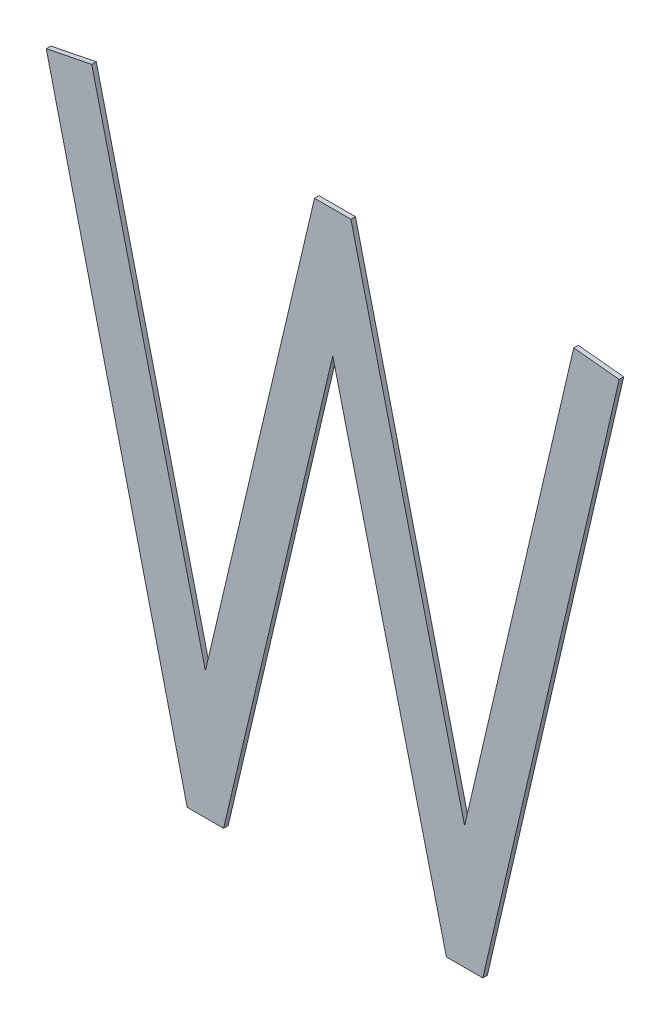
ISO-10303-21;
HEADER;
FILE_DESCRIPTION(('STEP AP214'),'2;1');
FILE_NAME('part.step','',(''),(''),'','','');
FILE_SCHEMA(('AUTOMOTIVE_DESIGN { 1 0 10303 214 1 1 1 1 }'));
ENDSEC;
DATA;
#1=APPLICATION_CONTEXT('core data for automotive mechanical design processes');
#2=APPLICATION_PROTOCOL_DEFINITION('international standard','automotive_design',2000,#1);
#3=PRODUCT_CONTEXT('',#1,'mechanical');
#4=PRODUCT('Part','Part','',(#3));
#5=PRODUCT_RELATED_PRODUCT_CATEGORY('part','',(#4));
#6=PRODUCT_DEFINITION_FORMATION('','',#4);
#7=PRODUCT_DEFINITION_CONTEXT('part definition',#1,'design');
#8=PRODUCT_DEFINITION('design','',#6,#7);
#9=PRODUCT_DEFINITION_SHAPE('','',#8);
#10=(LENGTH_UNIT() NAMED_UNIT(*) SI_UNIT(.MILLI.,.METRE.));
#11=(NAMED_UNIT(*) PLANE_ANGLE_UNIT() SI_UNIT($,.RADIAN.));
#12=(NAMED_UNIT(*) SI_UNIT($,.STERADIAN.) SOLID_ANGLE_UNIT());
#13=UNCERTAINTY_MEASURE_WITH_UNIT(LENGTH_MEASURE(1.E-05),#10,'distance_accuracy_value','');
#14=(GEOMETRIC_REPRESENTATION_CONTEXT(3) GLOBAL_UNCERTAINTY_ASSIGNED_CONTEXT((#13)) GLOBAL_UNIT_ASSIGNED_CONTEXT((#10,
#11,#12)) REPRESENTATION_CONTEXT('',''));
#15=CARTESIAN_POINT('',(0.,0.,0.));
#16=DIRECTION('',(0.,0.,1.));
#17=DIRECTION('',(1.,0.,0.));
#18=AXIS2_PLACEMENT_3D('',#15,#16,#17);
#19=CARTESIAN_POINT('',(-0.62999874,0.635,0.01));
#20=DIRECTION('',(0.,0.,-1.));
#21=DIRECTION('',(-1.,0.,0.));
#22=AXIS2_PLACEMENT_3D('',#19,#20,#21);
#23=PLANE('',#22);
#24=DIRECTION('',(1.,0.,0.));
#25=VECTOR('',#24,1.);
#26=CARTESIAN_POINT('',(-0.31999682,-0.65499996,0.01));
#27=LINE('',#26,#25);
#28=CARTESIAN_POINT('',(-0.319996819999876,-0.65499995999997,0.01));
#29=VERTEX_POINT('',#28);
#30=CARTESIAN_POINT('',(-0.23999698,-0.65499996,0.01));
#31=VERTEX_POINT('',#30);
#32=EDGE_CURVE('E166',#29,#31,#27,.T.);
#33=ORIENTED_EDGE('',*,*,#32,.T.);
#34=DIRECTION('',(-0.229038793293004,-0.973417295494016,0.));
#35=VECTOR('',#34,1.);
#36=CARTESIAN_POINT('',(-0.23999698,-0.65499996,0.01));
#37=LINE('',#36,#35);
#38=CARTESIAN_POINT('',(2.53999999732642E-06,0.36500054,0.01));
#39=VERTEX_POINT('',#38);
#40=EDGE_CURVE('E162',#31,#39,#37,.F.);
#41=ORIENTED_EDGE('',*,*,#40,.T.);
#42=DIRECTION('',(-0.238051498762019,0.971252533555077,0.));
#43=VECTOR('',#42,1.);
#44=CARTESIAN_POINT('',(2.539999996998E-06,0.36500054,0.01));
#45=LINE('',#44,#43);
#46=CARTESIAN_POINT('',(0.250002040000122,-0.65499995999997,0.01));
#47=VERTEX_POINT('',#46);
#48=EDGE_CURVE('E158',#39,#47,#45,.F.);
#49=ORIENTED_EDGE('',*,*,#48,.T.);
#50=DIRECTION('',(1.,0.,0.));
#51=VECTOR('',#50,1.);
#52=CARTESIAN_POINT('',(0.25000204,-0.65499996,0.01));
#53=LINE('',#52,#51);
#54=CARTESIAN_POINT('',(0.33000188,-0.65499996,0.01));
#55=VERTEX_POINT('',#54);
#56=EDGE_CURVE('E154',#47,#55,#53,.T.);
#57=ORIENTED_EDGE('',*,*,#56,.T.);
#58=DIRECTION('',(-0.226513071540985,-0.974008125438935,0.));
#59=VECTOR('',#58,1.);
#60=CARTESIAN_POINT('',(0.33000188,-0.65499996,0.01));
#61=LINE('',#60,#59);
#62=CARTESIAN_POINT('',(0.630001280000132,0.634999999999969,0.01));
#63=VERTEX_POINT('',#62);
#64=EDGE_CURVE('E150',#55,#63,#61,.F.);
#65=ORIENTED_EDGE('',*,*,#64,.T.);
#66=DIRECTION('',(0.995037190210014,-0.0995037190207514,0.));
#67=VECTOR('',#66,1.);
#68=CARTESIAN_POINT('',(0.63000128,0.635,0.01));
#69=LINE('',#68,#67);
#70=CARTESIAN_POINT('',(0.530001479999999,0.644999979999994,0.01));
#71=VERTEX_POINT('',#70);
#72=EDGE_CURVE('E146',#63,#71,#69,.F.);
#73=ORIENTED_EDGE('',*,*,#72,.T.);
#74=DIRECTION('',(0.22693069724005,0.973910908990214,0.));
#75=VECTOR('',#74,1.);
#76=CARTESIAN_POINT('',(0.53000148,0.64499998,0.01));
#77=LINE('',#76,#75);
#78=CARTESIAN_POINT('',(0.290001960000097,-0.384997960000023,0.01));
#79=VERTEX_POINT('',#78);
#80=EDGE_CURVE('E142',#71,#79,#77,.F.);
#81=ORIENTED_EDGE('',*,*,#80,.T.);
#82=DIRECTION('',(0.235870049887924,-0.971784605540687,0.));
#83=VECTOR('',#82,1.);
#84=CARTESIAN_POINT('',(0.29000196,-0.38499796,0.01));
#85=LINE('',#84,#83);
#86=CARTESIAN_POINT('',(0.0400024600001329,0.644999980000037,0.01));
#87=VERTEX_POINT('',#86);
#88=EDGE_CURVE('E138',#79,#87,#85,.F.);
#89=ORIENTED_EDGE('',*,*,#88,.T.);
#90=DIRECTION('',(1.,0.,0.));
#91=VECTOR('',#90,1.);
#92=CARTESIAN_POINT('',(0.04000245999998,0.64499998,0.01));
#93=LINE('',#92,#91);
#94=CARTESIAN_POINT('',(-0.03999738000002,0.64499998,0.01));
#95=VERTEX_POINT('',#94);
#96=EDGE_CURVE('E134',#87,#95,#93,.F.);
#97=ORIENTED_EDGE('',*,*,#96,.T.);
#98=DIRECTION('',(0.229039333726105,0.973417168333445,0.));
#99=VECTOR('',#98,1.);
#100=CARTESIAN_POINT('',(-0.03999738000002,0.64499998,0.01));
#101=LINE('',#100,#99);
#102=CARTESIAN_POINT('',(-0.279996900000151,-0.374997979999965,0.01));
#103=VERTEX_POINT('',#102);
#104=EDGE_CURVE('E110',#95,#103,#101,.F.);
#105=ORIENTED_EDGE('',*,*,#104,.T.);
#106=DIRECTION('',(0.23587231300609,-0.971784056237371,0.));
#107=VECTOR('',#106,1.);
#108=CARTESIAN_POINT('',(-0.2799969,-0.37499798,0.01));
#109=LINE('',#108,#107);
#110=CARTESIAN_POINT('',(-0.529998940000119,0.654999959999971,0.01));
#111=VERTEX_POINT('',#110);
#112=EDGE_CURVE('E112',#103,#111,#109,.F.);
#113=ORIENTED_EDGE('',*,*,#112,.T.);
#114=DIRECTION('',(0.980580675690959,0.196116135137992,0.));
#115=VECTOR('',#114,1.);
#116=CARTESIAN_POINT('',(-0.52999894,0.65499996,0.01));
#117=LINE('',#116,#115);
#118=CARTESIAN_POINT('',(-0.629998740000002,0.63500000000001,0.01));
#119=VERTEX_POINT('',#118);
#120=EDGE_CURVE('E20',#111,#119,#117,.F.);
#121=ORIENTED_EDGE('',*,*,#120,.T.);
#122=DIRECTION('',(-0.233659391412928,0.972318512013702,0.));
#123=VECTOR('',#122,1.);
#124=CARTESIAN_POINT('',(-0.62999874,0.635,0.01));
#125=LINE('',#124,#123);
#126=EDGE_CURVE('E171',#119,#29,#125,.F.);
#127=ORIENTED_EDGE('',*,*,#126,.T.);
#128=EDGE_LOOP('',(#33,#41,#49,#57,#65,#73,#81,#89,#97,#105,#113,#121,#127));
#129=FACE_BOUND('',#128,.T.);
#130=ADVANCED_FACE('F17',(#129),#23,.F.);
#131=CARTESIAN_POINT('',(-0.52999894,0.65499996,0.));
#132=DIRECTION('',(0.196116135137992,-0.980580675690959,0.));
#133=DIRECTION('',(0.980580675690959,0.196116135137992,0.));
#134=AXIS2_PLACEMENT_3D('',#131,#132,#133);
#135=PLANE('',#134);
#136=DIRECTION('',(0.,0.,1.));
#137=VECTOR('',#136,1.);
#138=CARTESIAN_POINT('',(-0.62999874,0.635,0.));
#139=LINE('',#138,#137);
#140=CARTESIAN_POINT('',(-0.629998740000002,0.63500000000001,0.));
#141=VERTEX_POINT('',#140);
#142=EDGE_CURVE('E123',#141,#119,#139,.T.);
#143=ORIENTED_EDGE('',*,*,#142,.T.);
#144=ORIENTED_EDGE('',*,*,#120,.F.);
#145=DIRECTION('',(0.,0.,1.));
#146=VECTOR('',#145,1.);
#147=CARTESIAN_POINT('',(-0.529998940000477,0.654999959999884,0.));
#148=LINE('',#147,#146);
#149=CARTESIAN_POINT('',(-0.529998940000119,0.654999959999971,0.));
#150=VERTEX_POINT('',#149);
#151=EDGE_CURVE('E118',#111,#150,#148,.F.);
#152=ORIENTED_EDGE('',*,*,#151,.T.);
#153=DIRECTION('',(0.98058067569092,0.196116135138184,0.));
#154=VECTOR('',#153,1.);
#155=CARTESIAN_POINT('',(-0.62999874,0.635,0.));
#156=LINE('',#155,#154);
#157=EDGE_CURVE('E174',#141,#150,#156,.T.);
#158=ORIENTED_EDGE('',*,*,#157,.F.);
#159=EDGE_LOOP('',(#143,#144,#152,#158));
#160=FACE_BOUND('',#159,.T.);
#161=ADVANCED_FACE('F120',(#160),#135,.F.);
#162=CARTESIAN_POINT('',(-0.2799969,-0.37499798,0.));
#163=DIRECTION('',(-0.971784056237371,-0.23587231300609,0.));
#164=DIRECTION('',(0.23587231300609,-0.971784056237371,0.));
#165=AXIS2_PLACEMENT_3D('',#162,#163,#164);
#166=PLANE('',#165);
#167=ORIENTED_EDGE('',*,*,#151,.F.);
#168=ORIENTED_EDGE('',*,*,#112,.F.);
#169=DIRECTION('',(0.,0.,1.));
#170=VECTOR('',#169,1.);
#171=CARTESIAN_POINT('',(-0.279996900000603,-0.374997979999858,0.));
#172=LINE('',#171,#170);
#173=CARTESIAN_POINT('',(-0.279996900000151,-0.374997979999965,0.));
#174=VERTEX_POINT('',#173);
#175=EDGE_CURVE('E130',#103,#174,#172,.F.);
#176=ORIENTED_EDGE('',*,*,#175,.T.);
#177=DIRECTION('',(0.23587231300564,-0.97178405623748,0.));
#178=VECTOR('',#177,1.);
#179=CARTESIAN_POINT('',(-0.52999894,0.65499996,0.));
#180=LINE('',#179,#178);
#181=EDGE_CURVE('E127',#150,#174,#180,.T.);
#182=ORIENTED_EDGE('',*,*,#181,.F.);
#183=EDGE_LOOP('',(#167,#168,#176,#182));
#184=FACE_BOUND('',#183,.T.);
#185=ADVANCED_FACE('F125',(#184),#166,.F.);
#186=CARTESIAN_POINT('',(-0.03999738000002,0.64499998,0.));
#187=DIRECTION('',(0.973417168333445,-0.229039333726105,0.));
#188=DIRECTION('',(0.229039333726105,0.973417168333445,0.));
#189=AXIS2_PLACEMENT_3D('',#186,#187,#188);
#190=PLANE('',#189);
#191=ORIENTED_EDGE('',*,*,#175,.F.);
#192=ORIENTED_EDGE('',*,*,#104,.F.);
#193=DIRECTION('',(0.,0.,-1.));
#194=VECTOR('',#193,1.);
#195=CARTESIAN_POINT('',(-0.03999738000002,0.64499998,0.));
#196=LINE('',#195,#194);
#197=CARTESIAN_POINT('',(-0.03999738000002,0.64499998,0.));
#198=VERTEX_POINT('',#197);
#199=EDGE_CURVE('E136',#95,#198,#196,.T.);
#200=ORIENTED_EDGE('',*,*,#199,.T.);
#201=DIRECTION('',(0.229039333725529,0.97341716833358,0.));
#202=VECTOR('',#201,1.);
#203=CARTESIAN_POINT('',(-0.2799969,-0.37499798,0.));
#204=LINE('',#203,#202);
#205=EDGE_CURVE('E177',#174,#198,#204,.T.);
#206=ORIENTED_EDGE('',*,*,#205,.F.);
#207=EDGE_LOOP('',(#191,#192,#200,#206));
#208=FACE_BOUND('',#207,.T.);
#209=ADVANCED_FACE('F251',(#208),#190,.F.);
#210=CARTESIAN_POINT('',(0.04000245999998,0.64499998,0.));
#211=DIRECTION('',(0.,-1.,0.));
#212=DIRECTION('',(0.,0.,-1.));
#213=AXIS2_PLACEMENT_3D('',#210,#211,#212);
#214=PLANE('',#213);
#215=ORIENTED_EDGE('',*,*,#199,.F.);
#216=ORIENTED_EDGE('',*,*,#96,.F.);
#217=DIRECTION('',(0.,0.,1.));
#218=VECTOR('',#217,1.);
#219=CARTESIAN_POINT('',(0.0400024600005917,0.644999980000149,0.));
#220=LINE('',#219,#218);
#221=CARTESIAN_POINT('',(0.0400024600001329,0.644999980000037,0.));
#222=VERTEX_POINT('',#221);
#223=EDGE_CURVE('E140',#87,#222,#220,.F.);
#224=ORIENTED_EDGE('',*,*,#223,.T.);
#225=DIRECTION('',(-1.,0.,0.));
#226=VECTOR('',#225,1.);
#227=CARTESIAN_POINT('',(-0.62999874,0.64499998,0.));
#228=LINE('',#227,#226);
#229=EDGE_CURVE('E180',#198,#222,#228,.F.);
#230=ORIENTED_EDGE('',*,*,#229,.F.);
#231=EDGE_LOOP('',(#215,#216,#224,#230));
#232=FACE_BOUND('',#231,.T.);
#233=ADVANCED_FACE('F247',(#232),#214,.F.);
#234=CARTESIAN_POINT('',(0.29000196,-0.38499796,0.));
#235=DIRECTION('',(-0.971784605540687,-0.235870049887924,0.));
#236=DIRECTION('',(0.235870049887924,-0.971784605540687,0.));
#237=AXIS2_PLACEMENT_3D('',#234,#235,#236);
#238=PLANE('',#237);
#239=ORIENTED_EDGE('',*,*,#223,.F.);
#240=ORIENTED_EDGE('',*,*,#88,.F.);
#241=DIRECTION('',(0.,0.,1.));
#242=VECTOR('',#241,1.);
#243=CARTESIAN_POINT('',(0.29000196000039,-0.384997960000091,0.));
#244=LINE('',#243,#242);
#245=CARTESIAN_POINT('',(0.290001960000097,-0.384997960000023,0.));
#246=VERTEX_POINT('',#245);
#247=EDGE_CURVE('E144',#79,#246,#244,.F.);
#248=ORIENTED_EDGE('',*,*,#247,.T.);
#249=DIRECTION('',(0.235870049888501,-0.971784605540547,0.));
#250=VECTOR('',#249,1.);
#251=CARTESIAN_POINT('',(0.04000245999998,0.64499998,0.));
#252=LINE('',#251,#250);
#253=EDGE_CURVE('E183',#222,#246,#252,.T.);
#254=ORIENTED_EDGE('',*,*,#253,.F.);
#255=EDGE_LOOP('',(#239,#240,#248,#254));
#256=FACE_BOUND('',#255,.T.);
#257=ADVANCED_FACE('F243',(#256),#238,.F.);
#258=CARTESIAN_POINT('',(0.53000148,0.64499998,0.));
#259=DIRECTION('',(0.973910908990214,-0.22693069724005,0.));
#260=DIRECTION('',(0.22693069724005,0.973910908990214,0.));
#261=AXIS2_PLACEMENT_3D('',#258,#259,#260);
#262=PLANE('',#261);
#263=ORIENTED_EDGE('',*,*,#247,.F.);
#264=ORIENTED_EDGE('',*,*,#80,.F.);
#265=DIRECTION('',(0.,0.,1.));
#266=VECTOR('',#265,1.);
#267=CARTESIAN_POINT('',(0.530001479999998,0.644999979999975,0.));
#268=LINE('',#267,#266);
#269=CARTESIAN_POINT('',(0.530001479999999,0.644999979999994,0.));
#270=VERTEX_POINT('',#269);
#271=EDGE_CURVE('E148',#71,#270,#268,.F.);
#272=ORIENTED_EDGE('',*,*,#271,.T.);
#273=DIRECTION('',(0.226930697240418,0.973910908990128,0.));
#274=VECTOR('',#273,1.);
#275=CARTESIAN_POINT('',(0.29000196,-0.38499796,0.));
#276=LINE('',#275,#274);
#277=EDGE_CURVE('E186',#246,#270,#276,.T.);
#278=ORIENTED_EDGE('',*,*,#277,.F.);
#279=EDGE_LOOP('',(#263,#264,#272,#278));
#280=FACE_BOUND('',#279,.T.);
#281=ADVANCED_FACE('F238',(#280),#262,.F.);
#282=CARTESIAN_POINT('',(0.63000128,0.635,0.));
#283=DIRECTION('',(-0.0995037190207514,-0.995037190210014,0.));
#284=DIRECTION('',(0.995037190210014,-0.0995037190207514,0.));
#285=AXIS2_PLACEMENT_3D('',#282,#283,#284);
#286=PLANE('',#285);
#287=ORIENTED_EDGE('',*,*,#271,.F.);
#288=ORIENTED_EDGE('',*,*,#72,.F.);
#289=DIRECTION('',(0.,0.,1.));
#290=VECTOR('',#289,1.);
#291=CARTESIAN_POINT('',(0.630001280000528,0.634999999999878,0.));
#292=LINE('',#291,#290);
#293=CARTESIAN_POINT('',(0.630001280000132,0.63499999999997,0.));
#294=VERTEX_POINT('',#293);
#295=EDGE_CURVE('E152',#63,#294,#292,.F.);
#296=ORIENTED_EDGE('',*,*,#295,.T.);
#297=DIRECTION('',(0.995037190209989,-0.0995037190209989,0.));
#298=VECTOR('',#297,1.);
#299=CARTESIAN_POINT('',(0.53000148,0.64499998,0.));
#300=LINE('',#299,#298);
#301=EDGE_CURVE('E189',#270,#294,#300,.T.);
#302=ORIENTED_EDGE('',*,*,#301,.F.);
#303=EDGE_LOOP('',(#287,#288,#296,#302));
#304=FACE_BOUND('',#303,.T.);
#305=ADVANCED_FACE('F233',(#304),#286,.F.);
#306=CARTESIAN_POINT('',(0.33000188,-0.65499996,0.));
#307=DIRECTION('',(-0.974008125438935,0.226513071540985,0.));
#308=DIRECTION('',(-0.226513071540985,-0.974008125438935,0.));
#309=AXIS2_PLACEMENT_3D('',#306,#307,#308);
#310=PLANE('',#309);
#311=ORIENTED_EDGE('',*,*,#295,.F.);
#312=ORIENTED_EDGE('',*,*,#64,.F.);
#313=DIRECTION('',(0.,0.,1.));
#314=VECTOR('',#313,1.);
#315=CARTESIAN_POINT('',(0.33000188,-0.65499996,0.));
#316=LINE('',#315,#314);
#317=CARTESIAN_POINT('',(0.33000188,-0.65499996,0.));
#318=VERTEX_POINT('',#317);
#319=EDGE_CURVE('E156',#55,#318,#316,.F.);
#320=ORIENTED_EDGE('',*,*,#319,.T.);
#321=DIRECTION('',(-0.226513071540586,-0.974008125439028,0.));
#322=VECTOR('',#321,1.);
#323=CARTESIAN_POINT('',(0.63000128,0.635,0.));
#324=LINE('',#323,#322);
#325=EDGE_CURVE('E192',#294,#318,#324,.T.);
#326=ORIENTED_EDGE('',*,*,#325,.F.);
#327=EDGE_LOOP('',(#311,#312,#320,#326));
#328=FACE_BOUND('',#327,.T.);
#329=ADVANCED_FACE('F228',(#328),#310,.F.);
#330=CARTESIAN_POINT('',(0.25000204,-0.65499996,0.));
#331=DIRECTION('',(0.,1.,0.));
#332=DIRECTION('',(0.,0.,1.));
#333=AXIS2_PLACEMENT_3D('',#330,#331,#332);
#334=PLANE('',#333);
#335=ORIENTED_EDGE('',*,*,#319,.F.);
#336=ORIENTED_EDGE('',*,*,#56,.F.);
#337=DIRECTION('',(0.,0.,1.));
#338=VECTOR('',#337,1.);
#339=CARTESIAN_POINT('',(0.250002040000489,-0.65499995999988,0.));
#340=LINE('',#339,#338);
#341=CARTESIAN_POINT('',(0.250002040000122,-0.65499995999997,0.));
#342=VERTEX_POINT('',#341);
#343=EDGE_CURVE('E160',#47,#342,#340,.F.);
#344=ORIENTED_EDGE('',*,*,#343,.T.);
#345=DIRECTION('',(-1.,0.,0.));
#346=VECTOR('',#345,1.);
#347=CARTESIAN_POINT('',(-0.62999874,-0.65499996,0.));
#348=LINE('',#347,#346);
#349=EDGE_CURVE('E195',#318,#342,#348,.T.);
#350=ORIENTED_EDGE('',*,*,#349,.F.);
#351=EDGE_LOOP('',(#335,#336,#344,#350));
#352=FACE_BOUND('',#351,.T.);
#353=ADVANCED_FACE('F223',(#352),#334,.F.);
#354=CARTESIAN_POINT('',(2.539999996998E-06,0.36500054,0.));
#355=DIRECTION('',(0.971252533555077,0.238051498762019,0.));
#356=DIRECTION('',(-0.238051498762019,0.971252533555077,0.));
#357=AXIS2_PLACEMENT_3D('',#354,#355,#356);
#358=PLANE('',#357);
#359=ORIENTED_EDGE('',*,*,#343,.F.);
#360=ORIENTED_EDGE('',*,*,#48,.F.);
#361=DIRECTION('',(0.,0.,1.));
#362=VECTOR('',#361,1.);
#363=CARTESIAN_POINT('',(2.53999999836165E-06,0.36500054,0.));
#364=LINE('',#363,#362);
#365=CARTESIAN_POINT('',(2.53999999732928E-06,0.36500054,0.));
#366=VERTEX_POINT('',#365);
#367=EDGE_CURVE('E164',#39,#366,#364,.F.);
#368=ORIENTED_EDGE('',*,*,#367,.T.);
#369=DIRECTION('',(-0.238051498761554,0.971252533555191,0.));
#370=VECTOR('',#369,1.);
#371=CARTESIAN_POINT('',(0.25000204,-0.65499996,0.));
#372=LINE('',#371,#370);
#373=EDGE_CURVE('E198',#342,#366,#372,.T.);
#374=ORIENTED_EDGE('',*,*,#373,.F.);
#375=EDGE_LOOP('',(#359,#360,#368,#374));
#376=FACE_BOUND('',#375,.T.);
#377=ADVANCED_FACE('F218',(#376),#358,.F.);
#378=CARTESIAN_POINT('',(-0.23999698,-0.65499996,0.));
#379=DIRECTION('',(-0.973417295494016,0.229038793293004,0.));
#380=DIRECTION('',(-0.229038793293004,-0.973417295494016,0.));
#381=AXIS2_PLACEMENT_3D('',#378,#379,#380);
#382=PLANE('',#381);
#383=ORIENTED_EDGE('',*,*,#367,.F.);
#384=ORIENTED_EDGE('',*,*,#40,.F.);
#385=DIRECTION('',(0.,0.,1.));
#386=VECTOR('',#385,1.);
#387=CARTESIAN_POINT('',(-0.23999698,-0.65499996,0.));
#388=LINE('',#387,#386);
#389=CARTESIAN_POINT('',(-0.23999698,-0.65499996,0.));
#390=VERTEX_POINT('',#389);
#391=EDGE_CURVE('E168',#31,#390,#388,.F.);
#392=ORIENTED_EDGE('',*,*,#391,.T.);
#393=DIRECTION('',(-0.229038793293003,-0.973417295494016,0.));
#394=VECTOR('',#393,1.);
#395=CARTESIAN_POINT('',(2.5399999970064E-06,0.36500054,0.));
#396=LINE('',#395,#394);
#397=EDGE_CURVE('E201',#366,#390,#396,.T.);
#398=ORIENTED_EDGE('',*,*,#397,.F.);
#399=EDGE_LOOP('',(#383,#384,#392,#398));
#400=FACE_BOUND('',#399,.T.);
#401=ADVANCED_FACE('F213',(#400),#382,.F.);
#402=CARTESIAN_POINT('',(-0.31999682,-0.65499996,0.));
#403=DIRECTION('',(0.,1.,0.));
#404=DIRECTION('',(0.,0.,1.));
#405=AXIS2_PLACEMENT_3D('',#402,#403,#404);
#406=PLANE('',#405);
#407=ORIENTED_EDGE('',*,*,#391,.F.);
#408=ORIENTED_EDGE('',*,*,#32,.F.);
#409=DIRECTION('',(0.,0.,1.));
#410=VECTOR('',#409,1.);
#411=CARTESIAN_POINT('',(-0.319996819999503,-0.654999959999881,0.));
#412=LINE('',#411,#410);
#413=CARTESIAN_POINT('',(-0.319996819999876,-0.65499995999997,0.));
#414=VERTEX_POINT('',#413);
#415=EDGE_CURVE('E35',#29,#414,#412,.F.);
#416=ORIENTED_EDGE('',*,*,#415,.T.);
#417=DIRECTION('',(-1.,0.,0.));
#418=VECTOR('',#417,1.);
#419=CARTESIAN_POINT('',(-0.62999874,-0.65499996,0.));
#420=LINE('',#419,#418);
#421=EDGE_CURVE('E26',#390,#414,#420,.T.);
#422=ORIENTED_EDGE('',*,*,#421,.F.);
#423=EDGE_LOOP('',(#407,#408,#416,#422));
#424=FACE_BOUND('',#423,.T.);
#425=ADVANCED_FACE('F209',(#424),#406,.F.);
#426=CARTESIAN_POINT('',(-0.62999874,0.635,0.));
#427=DIRECTION('',(0.972318512013702,0.233659391412928,0.));
#428=DIRECTION('',(-0.233659391412928,0.972318512013702,0.));
#429=AXIS2_PLACEMENT_3D('',#426,#427,#428);
#430=PLANE('',#429);
#431=ORIENTED_EDGE('',*,*,#415,.F.);
#432=ORIENTED_EDGE('',*,*,#126,.F.);
#433=ORIENTED_EDGE('',*,*,#142,.F.);
#434=DIRECTION('',(-0.233659391412554,0.972318512013792,0.));
#435=VECTOR('',#434,1.);
#436=CARTESIAN_POINT('',(-0.31999682,-0.65499996,0.));
#437=LINE('',#436,#435);
#438=EDGE_CURVE('E11',#414,#141,#437,.T.);
#439=ORIENTED_EDGE('',*,*,#438,.F.);
#440=EDGE_LOOP('',(#431,#432,#433,#439));
#441=FACE_BOUND('',#440,.T.);
#442=ADVANCED_FACE('F253',(#441),#430,.F.);
#443=CARTESIAN_POINT('',(-0.62999874,0.635,0.));
#444=DIRECTION('',(0.,0.,-1.));
#445=DIRECTION('',(-1.,0.,0.));
#446=AXIS2_PLACEMENT_3D('',#443,#444,#445);
#447=PLANE('',#446);
#448=ORIENTED_EDGE('',*,*,#421,.T.);
#449=ORIENTED_EDGE('',*,*,#438,.T.);
#450=ORIENTED_EDGE('',*,*,#157,.T.);
#451=ORIENTED_EDGE('',*,*,#181,.T.);
#452=ORIENTED_EDGE('',*,*,#205,.T.);
#453=ORIENTED_EDGE('',*,*,#229,.T.);
#454=ORIENTED_EDGE('',*,*,#253,.T.);
#455=ORIENTED_EDGE('',*,*,#277,.T.);
#456=ORIENTED_EDGE('',*,*,#301,.T.);
#457=ORIENTED_EDGE('',*,*,#325,.T.);
#458=ORIENTED_EDGE('',*,*,#349,.T.);
#459=ORIENTED_EDGE('',*,*,#373,.T.);
#460=ORIENTED_EDGE('',*,*,#397,.T.);
#461=EDGE_LOOP('',(#448,#449,#450,#451,#452,#453,#454,#455,#456,#457,#458,#459,#460));
#462=FACE_BOUND('',#461,.T.);
#463=ADVANCED_FACE('F206',(#462),#447,.T.);
#464=CLOSED_SHELL('',(#130,#161,#185,#209,#233,#257,#281,#305,#329,#353,#377,#401,#425,#442,#463));
#465=MANIFOLD_SOLID_BREP('B1',#464);
#466=ADVANCED_BREP_SHAPE_REPRESENTATION('',(#18,#465),#14);
#467=SHAPE_DEFINITION_REPRESENTATION(#9,#466);
ENDSEC;
END-ISO-10303-21;
